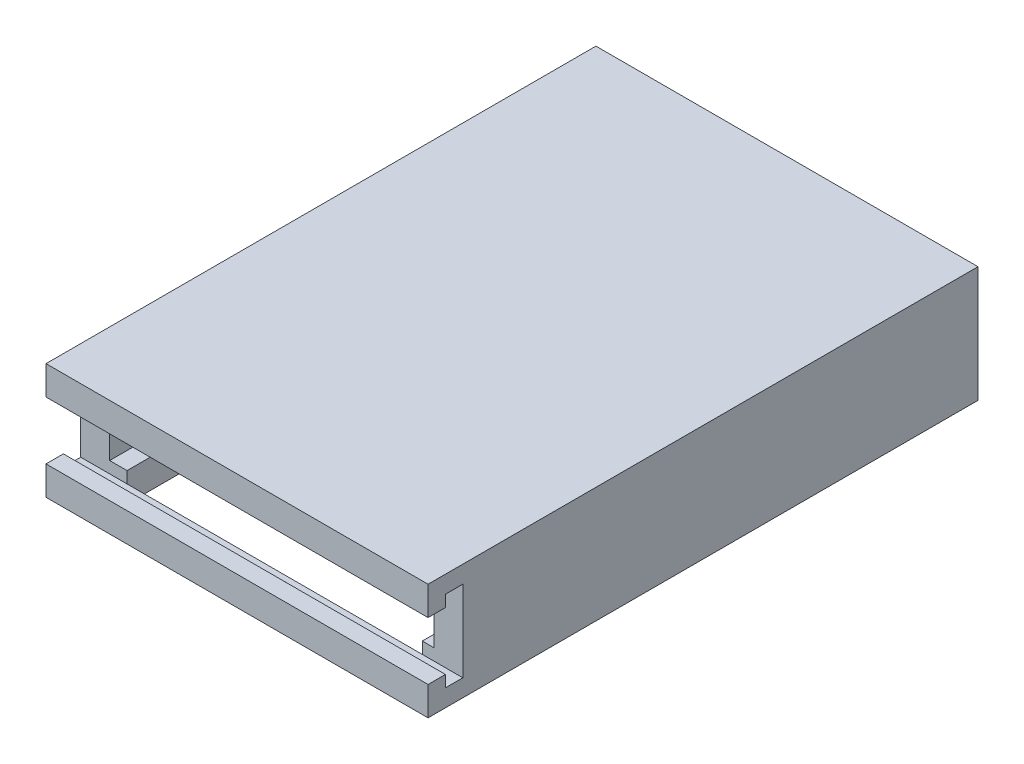
ISO-10303-21;
HEADER;
FILE_DESCRIPTION(('STEP AP214'),'2;1');
FILE_NAME('part.step','',(''),(''),'','','');
FILE_SCHEMA(('AUTOMOTIVE_DESIGN { 1 0 10303 214 1 1 1 1 }'));
ENDSEC;
DATA;
#1=APPLICATION_CONTEXT('core data for automotive mechanical design processes');
#2=APPLICATION_PROTOCOL_DEFINITION('international standard','automotive_design',2000,#1);
#3=PRODUCT_CONTEXT('',#1,'mechanical');
#4=PRODUCT('Part','Part','',(#3));
#5=PRODUCT_RELATED_PRODUCT_CATEGORY('part','',(#4));
#6=PRODUCT_DEFINITION_FORMATION('','',#4);
#7=PRODUCT_DEFINITION_CONTEXT('part definition',#1,'design');
#8=PRODUCT_DEFINITION('design','',#6,#7);
#9=PRODUCT_DEFINITION_SHAPE('','',#8);
#10=(LENGTH_UNIT() NAMED_UNIT(*) SI_UNIT(.MILLI.,.METRE.));
#11=(NAMED_UNIT(*) PLANE_ANGLE_UNIT() SI_UNIT($,.RADIAN.));
#12=(NAMED_UNIT(*) SI_UNIT($,.STERADIAN.) SOLID_ANGLE_UNIT());
#13=UNCERTAINTY_MEASURE_WITH_UNIT(LENGTH_MEASURE(1.E-05),#10,'distance_accuracy_value','');
#14=(GEOMETRIC_REPRESENTATION_CONTEXT(3) GLOBAL_UNCERTAINTY_ASSIGNED_CONTEXT((#13)) GLOBAL_UNIT_ASSIGNED_CONTEXT((#10,
#11,#12)) REPRESENTATION_CONTEXT('',''));
#15=CARTESIAN_POINT('',(0.,0.,0.));
#16=DIRECTION('',(0.,0.,1.));
#17=DIRECTION('',(1.,0.,0.));
#18=AXIS2_PLACEMENT_3D('',#15,#16,#17);
#19=CARTESIAN_POINT('',(0.,0.,84.));
#20=DIRECTION('',(0.,0.,1.));
#21=DIRECTION('',(1.,0.,0.));
#22=AXIS2_PLACEMENT_3D('',#19,#20,#21);
#23=PLANE('',#22);
#24=DIRECTION('',(-1.,0.,0.));
#25=VECTOR('',#24,1.);
#26=CARTESIAN_POINT('',(61.,-2.,84.));
#27=LINE('',#26,#25);
#28=CARTESIAN_POINT('',(61.,-2.,84.));
#29=VERTEX_POINT('',#28);
#30=CARTESIAN_POINT('',(54.,-2.,84.));
#31=VERTEX_POINT('',#30);
#32=EDGE_CURVE('E54',#29,#31,#27,.T.);
#33=ORIENTED_EDGE('',*,*,#32,.F.);
#34=DIRECTION('',(0.,1.,0.));
#35=VECTOR('',#34,1.);
#36=CARTESIAN_POINT('',(61.,0.,84.));
#37=LINE('',#36,#35);
#38=CARTESIAN_POINT('',(61.,12.,84.));
#39=VERTEX_POINT('',#38);
#40=EDGE_CURVE('E196',#29,#39,#37,.T.);
#41=ORIENTED_EDGE('',*,*,#40,.T.);
#42=DIRECTION('',(-1.,0.,0.));
#43=VECTOR('',#42,1.);
#44=CARTESIAN_POINT('',(61.,12.,84.));
#45=LINE('',#44,#43);
#46=CARTESIAN_POINT('',(-5.,12.,84.));
#47=VERTEX_POINT('',#46);
#48=EDGE_CURVE('E357',#39,#47,#45,.T.);
#49=ORIENTED_EDGE('',*,*,#48,.T.);
#50=DIRECTION('',(0.,1.,0.));
#51=VECTOR('',#50,1.);
#52=CARTESIAN_POINT('',(-5.,0.,84.));
#53=LINE('',#52,#51);
#54=CARTESIAN_POINT('',(-5.,-2.,84.));
#55=VERTEX_POINT('',#54);
#56=EDGE_CURVE('E62',#55,#47,#53,.T.);
#57=ORIENTED_EDGE('',*,*,#56,.F.);
#58=CARTESIAN_POINT('',(3.,-2.,84.));
#59=VERTEX_POINT('',#58);
#60=EDGE_CURVE('E204',#59,#55,#27,.T.);
#61=ORIENTED_EDGE('',*,*,#60,.F.);
#62=DIRECTION('',(0.,1.,0.));
#63=VECTOR('',#62,1.);
#64=CARTESIAN_POINT('',(3.,-5.,84.));
#65=LINE('',#64,#63);
#66=CARTESIAN_POINT('',(3.,0.,84.));
#67=VERTEX_POINT('',#66);
#68=EDGE_CURVE('E295',#59,#67,#65,.T.);
#69=ORIENTED_EDGE('',*,*,#68,.T.);
#70=DIRECTION('',(-1.,0.,0.));
#71=VECTOR('',#70,1.);
#72=CARTESIAN_POINT('',(-5.,0.,84.));
#73=LINE('',#72,#71);
#74=CARTESIAN_POINT('',(0.,0.,84.));
#75=VERTEX_POINT('',#74);
#76=EDGE_CURVE('E292',#67,#75,#73,.T.);
#77=ORIENTED_EDGE('',*,*,#76,.T.);
#78=DIRECTION('',(0.,1.,0.));
#79=VECTOR('',#78,1.);
#80=CARTESIAN_POINT('',(0.,0.,84.));
#81=LINE('',#80,#79);
#82=CARTESIAN_POINT('',(0.,10.,84.));
#83=VERTEX_POINT('',#82);
#84=EDGE_CURVE('E211',#75,#83,#81,.T.);
#85=ORIENTED_EDGE('',*,*,#84,.T.);
#86=DIRECTION('',(1.,0.,0.));
#87=VECTOR('',#86,1.);
#88=CARTESIAN_POINT('',(0.,10.,84.));
#89=LINE('',#88,#87);
#90=CARTESIAN_POINT('',(56.,10.,84.));
#91=VERTEX_POINT('',#90);
#92=EDGE_CURVE('E220',#83,#91,#89,.T.);
#93=ORIENTED_EDGE('',*,*,#92,.T.);
#94=DIRECTION('',(0.,1.,0.));
#95=VECTOR('',#94,1.);
#96=CARTESIAN_POINT('',(56.,0.,84.));
#97=LINE('',#96,#95);
#98=CARTESIAN_POINT('',(56.,0.,84.));
#99=VERTEX_POINT('',#98);
#100=EDGE_CURVE('E222',#99,#91,#97,.T.);
#101=ORIENTED_EDGE('',*,*,#100,.F.);
#102=DIRECTION('',(-1.,0.,0.));
#103=VECTOR('',#102,1.);
#104=CARTESIAN_POINT('',(61.,0.,84.));
#105=LINE('',#104,#103);
#106=CARTESIAN_POINT('',(54.,0.,84.));
#107=VERTEX_POINT('',#106);
#108=EDGE_CURVE('E264',#99,#107,#105,.T.);
#109=ORIENTED_EDGE('',*,*,#108,.T.);
#110=DIRECTION('',(0.,1.,0.));
#111=VECTOR('',#110,1.);
#112=CARTESIAN_POINT('',(54.,-5.,84.));
#113=LINE('',#112,#111);
#114=EDGE_CURVE('E199',#31,#107,#113,.T.);
#115=ORIENTED_EDGE('',*,*,#114,.F.);
#116=EDGE_LOOP('',(#33,#41,#49,#57,#61,#69,#77,#85,#93,#101,#109,#115));
#117=FACE_BOUND('',#116,.T.);
#118=ADVANCED_FACE('F39',(#117),#23,.T.);
#119=CARTESIAN_POINT('',(61.,0.,84.));
#120=DIRECTION('',(-1.,0.,0.));
#121=DIRECTION('',(0.,0.,1.));
#122=AXIS2_PLACEMENT_3D('',#119,#120,#121);
#123=PLANE('',#122);
#124=DIRECTION('',(0.,0.,1.));
#125=VECTOR('',#124,1.);
#126=CARTESIAN_POINT('',(61.,-5.,0.));
#127=LINE('',#126,#125);
#128=CARTESIAN_POINT('',(61.,-5.,-5.));
#129=VERTEX_POINT('',#128);
#130=CARTESIAN_POINT('',(61.,-5.,90.));
#131=VERTEX_POINT('',#130);
#132=EDGE_CURVE('E275',#129,#131,#127,.T.);
#133=ORIENTED_EDGE('',*,*,#132,.F.);
#134=DIRECTION('',(0.,-1.,0.));
#135=VECTOR('',#134,1.);
#136=CARTESIAN_POINT('',(61.,15.,-5.));
#137=LINE('',#136,#135);
#138=CARTESIAN_POINT('',(61.,15.,-5.));
#139=VERTEX_POINT('',#138);
#140=EDGE_CURVE('E273',#139,#129,#137,.T.);
#141=ORIENTED_EDGE('',*,*,#140,.F.);
#142=DIRECTION('',(0.,0.,-1.));
#143=VECTOR('',#142,1.);
#144=CARTESIAN_POINT('',(61.,15.,84.));
#145=LINE('',#144,#143);
#146=CARTESIAN_POINT('',(61.,15.,90.));
#147=VERTEX_POINT('',#146);
#148=EDGE_CURVE('E11',#147,#139,#145,.T.);
#149=ORIENTED_EDGE('',*,*,#148,.F.);
#150=DIRECTION('',(0.,1.,0.));
#151=VECTOR('',#150,1.);
#152=CARTESIAN_POINT('',(61.,15.,90.));
#153=LINE('',#152,#151);
#154=CARTESIAN_POINT('',(61.,10.,90.));
#155=VERTEX_POINT('',#154);
#156=EDGE_CURVE('E354',#155,#147,#153,.T.);
#157=ORIENTED_EDGE('',*,*,#156,.F.);
#158=DIRECTION('',(0.,0.,1.));
#159=VECTOR('',#158,1.);
#160=CARTESIAN_POINT('',(61.,10.,90.));
#161=LINE('',#160,#159);
#162=CARTESIAN_POINT('',(61.,10.,87.));
#163=VERTEX_POINT('',#162);
#164=EDGE_CURVE('E351',#163,#155,#161,.T.);
#165=ORIENTED_EDGE('',*,*,#164,.F.);
#166=DIRECTION('',(0.,-1.,0.));
#167=VECTOR('',#166,1.);
#168=CARTESIAN_POINT('',(61.,10.,87.));
#169=LINE('',#168,#167);
#170=CARTESIAN_POINT('',(61.,12.,87.));
#171=VERTEX_POINT('',#170);
#172=EDGE_CURVE('E348',#171,#163,#169,.T.);
#173=ORIENTED_EDGE('',*,*,#172,.F.);
#174=DIRECTION('',(0.,0.,1.));
#175=VECTOR('',#174,1.);
#176=CARTESIAN_POINT('',(61.,12.,87.));
#177=LINE('',#176,#175);
#178=EDGE_CURVE('E208',#39,#171,#177,.T.);
#179=ORIENTED_EDGE('',*,*,#178,.F.);
#180=ORIENTED_EDGE('',*,*,#40,.F.);
#181=DIRECTION('',(0.,0.,-1.));
#182=VECTOR('',#181,1.);
#183=CARTESIAN_POINT('',(61.,-2.,87.));
#184=LINE('',#183,#182);
#185=CARTESIAN_POINT('',(61.,-2.,87.));
#186=VERTEX_POINT('',#185);
#187=EDGE_CURVE('E182',#186,#29,#184,.T.);
#188=ORIENTED_EDGE('',*,*,#187,.F.);
#189=DIRECTION('',(0.,-1.,0.));
#190=VECTOR('',#189,1.);
#191=CARTESIAN_POINT('',(61.,0.,87.));
#192=LINE('',#191,#190);
#193=CARTESIAN_POINT('',(61.,0.,87.));
#194=VERTEX_POINT('',#193);
#195=EDGE_CURVE('E405',#194,#186,#192,.T.);
#196=ORIENTED_EDGE('',*,*,#195,.F.);
#197=DIRECTION('',(0.,0.,-1.));
#198=VECTOR('',#197,1.);
#199=CARTESIAN_POINT('',(61.,0.,90.));
#200=LINE('',#199,#198);
#201=CARTESIAN_POINT('',(61.,0.,90.));
#202=VERTEX_POINT('',#201);
#203=EDGE_CURVE('E402',#202,#194,#200,.T.);
#204=ORIENTED_EDGE('',*,*,#203,.F.);
#205=DIRECTION('',(0.,1.,0.));
#206=VECTOR('',#205,1.);
#207=CARTESIAN_POINT('',(61.,-5.,90.));
#208=LINE('',#207,#206);
#209=EDGE_CURVE('E190',#131,#202,#208,.T.);
#210=ORIENTED_EDGE('',*,*,#209,.F.);
#211=EDGE_LOOP('',(#133,#141,#149,#157,#165,#173,#179,#180,#188,#196,#204,#210));
#212=FACE_BOUND('',#211,.T.);
#213=ADVANCED_FACE('F41',(#212),#123,.F.);
#214=CARTESIAN_POINT('',(0.,15.,84.));
#215=DIRECTION('',(0.,1.,0.));
#216=DIRECTION('',(0.,0.,1.));
#217=AXIS2_PLACEMENT_3D('',#214,#215,#216);
#218=PLANE('',#217);
#219=ORIENTED_EDGE('',*,*,#148,.T.);
#220=DIRECTION('',(1.,0.,0.));
#221=VECTOR('',#220,1.);
#222=CARTESIAN_POINT('',(61.,15.,-5.));
#223=LINE('',#222,#221);
#224=CARTESIAN_POINT('',(-5.,15.,-5.));
#225=VERTEX_POINT('',#224);
#226=EDGE_CURVE('E258',#225,#139,#223,.T.);
#227=ORIENTED_EDGE('',*,*,#226,.F.);
#228=DIRECTION('',(0.,0.,-1.));
#229=VECTOR('',#228,1.);
#230=CARTESIAN_POINT('',(-5.,15.,84.));
#231=LINE('',#230,#229);
#232=CARTESIAN_POINT('',(-5.,15.,90.));
#233=VERTEX_POINT('',#232);
#234=EDGE_CURVE('E47',#233,#225,#231,.T.);
#235=ORIENTED_EDGE('',*,*,#234,.F.);
#236=DIRECTION('',(-1.,0.,0.));
#237=VECTOR('',#236,1.);
#238=CARTESIAN_POINT('',(61.,15.,90.));
#239=LINE('',#238,#237);
#240=EDGE_CURVE('E274',#147,#233,#239,.T.);
#241=ORIENTED_EDGE('',*,*,#240,.F.);
#242=EDGE_LOOP('',(#219,#227,#235,#241));
#243=FACE_BOUND('',#242,.T.);
#244=ADVANCED_FACE('F263',(#243),#218,.T.);
#245=CARTESIAN_POINT('',(-5.,0.,84.));
#246=DIRECTION('',(-1.,0.,0.));
#247=DIRECTION('',(0.,0.,1.));
#248=AXIS2_PLACEMENT_3D('',#245,#246,#247);
#249=PLANE('',#248);
#250=ORIENTED_EDGE('',*,*,#234,.T.);
#251=DIRECTION('',(0.,1.,0.));
#252=VECTOR('',#251,1.);
#253=CARTESIAN_POINT('',(-5.,15.,-5.));
#254=LINE('',#253,#252);
#255=CARTESIAN_POINT('',(-5.,-5.,-5.));
#256=VERTEX_POINT('',#255);
#257=EDGE_CURVE('E245',#256,#225,#254,.T.);
#258=ORIENTED_EDGE('',*,*,#257,.F.);
#259=DIRECTION('',(0.,0.,-1.));
#260=VECTOR('',#259,1.);
#261=CARTESIAN_POINT('',(-5.,-5.,84.));
#262=LINE('',#261,#260);
#263=CARTESIAN_POINT('',(-5.,-5.,90.));
#264=VERTEX_POINT('',#263);
#265=EDGE_CURVE('E289',#264,#256,#262,.T.);
#266=ORIENTED_EDGE('',*,*,#265,.F.);
#267=DIRECTION('',(0.,1.,0.));
#268=VECTOR('',#267,1.);
#269=CARTESIAN_POINT('',(-5.,-5.,90.));
#270=LINE('',#269,#268);
#271=CARTESIAN_POINT('',(-5.,0.,90.));
#272=VERTEX_POINT('',#271);
#273=EDGE_CURVE('E383',#264,#272,#270,.T.);
#274=ORIENTED_EDGE('',*,*,#273,.T.);
#275=DIRECTION('',(0.,0.,-1.));
#276=VECTOR('',#275,1.);
#277=CARTESIAN_POINT('',(-5.,0.,90.));
#278=LINE('',#277,#276);
#279=CARTESIAN_POINT('',(-5.,0.,87.));
#280=VERTEX_POINT('',#279);
#281=EDGE_CURVE('E386',#272,#280,#278,.T.);
#282=ORIENTED_EDGE('',*,*,#281,.T.);
#283=DIRECTION('',(0.,-1.,0.));
#284=VECTOR('',#283,1.);
#285=CARTESIAN_POINT('',(-5.,0.,87.));
#286=LINE('',#285,#284);
#287=CARTESIAN_POINT('',(-5.,-2.,87.));
#288=VERTEX_POINT('',#287);
#289=EDGE_CURVE('E191',#280,#288,#286,.T.);
#290=ORIENTED_EDGE('',*,*,#289,.T.);
#291=DIRECTION('',(0.,0.,-1.));
#292=VECTOR('',#291,1.);
#293=CARTESIAN_POINT('',(-5.,-2.,87.));
#294=LINE('',#293,#292);
#295=EDGE_CURVE('E389',#288,#55,#294,.T.);
#296=ORIENTED_EDGE('',*,*,#295,.T.);
#297=ORIENTED_EDGE('',*,*,#56,.T.);
#298=DIRECTION('',(0.,0.,1.));
#299=VECTOR('',#298,1.);
#300=CARTESIAN_POINT('',(-5.,12.,87.));
#301=LINE('',#300,#299);
#302=CARTESIAN_POINT('',(-5.,12.,87.));
#303=VERTEX_POINT('',#302);
#304=EDGE_CURVE('E358',#47,#303,#301,.T.);
#305=ORIENTED_EDGE('',*,*,#304,.T.);
#306=DIRECTION('',(0.,-1.,0.));
#307=VECTOR('',#306,1.);
#308=CARTESIAN_POINT('',(-5.,10.,87.));
#309=LINE('',#308,#307);
#310=CARTESIAN_POINT('',(-5.,10.,87.));
#311=VERTEX_POINT('',#310);
#312=EDGE_CURVE('E360',#303,#311,#309,.T.);
#313=ORIENTED_EDGE('',*,*,#312,.T.);
#314=DIRECTION('',(0.,0.,1.));
#315=VECTOR('',#314,1.);
#316=CARTESIAN_POINT('',(-5.,10.,90.));
#317=LINE('',#316,#315);
#318=CARTESIAN_POINT('',(-5.,10.,90.));
#319=VERTEX_POINT('',#318);
#320=EDGE_CURVE('E363',#311,#319,#317,.T.);
#321=ORIENTED_EDGE('',*,*,#320,.T.);
#322=DIRECTION('',(0.,1.,0.));
#323=VECTOR('',#322,1.);
#324=CARTESIAN_POINT('',(-5.,15.,90.));
#325=LINE('',#324,#323);
#326=EDGE_CURVE('E248',#319,#233,#325,.T.);
#327=ORIENTED_EDGE('',*,*,#326,.T.);
#328=EDGE_LOOP('',(#250,#258,#266,#274,#282,#290,#296,#297,#305,#313,#321,#327));
#329=FACE_BOUND('',#328,.T.);
#330=ADVANCED_FACE('F244',(#329),#249,.T.);
#331=CARTESIAN_POINT('',(0.,0.,84.));
#332=DIRECTION('',(-1.,0.,0.));
#333=DIRECTION('',(0.,0.,1.));
#334=AXIS2_PLACEMENT_3D('',#331,#332,#333);
#335=PLANE('',#334);
#336=DIRECTION('',(0.,1.,0.));
#337=VECTOR('',#336,1.);
#338=CARTESIAN_POINT('',(0.,0.,0.));
#339=LINE('',#338,#337);
#340=CARTESIAN_POINT('',(0.,0.,0.));
#341=VERTEX_POINT('',#340);
#342=CARTESIAN_POINT('',(0.,10.,0.));
#343=VERTEX_POINT('',#342);
#344=EDGE_CURVE('E226',#341,#343,#339,.T.);
#345=ORIENTED_EDGE('',*,*,#344,.T.);
#346=DIRECTION('',(0.,0.,-1.));
#347=VECTOR('',#346,1.);
#348=CARTESIAN_POINT('',(0.,10.,84.));
#349=LINE('',#348,#347);
#350=EDGE_CURVE('E236',#83,#343,#349,.T.);
#351=ORIENTED_EDGE('',*,*,#350,.F.);
#352=ORIENTED_EDGE('',*,*,#84,.F.);
#353=DIRECTION('',(0.,0.,-1.));
#354=VECTOR('',#353,1.);
#355=CARTESIAN_POINT('',(0.,0.,84.));
#356=LINE('',#355,#354);
#357=EDGE_CURVE('E239',#75,#341,#356,.T.);
#358=ORIENTED_EDGE('',*,*,#357,.T.);
#359=EDGE_LOOP('',(#345,#351,#352,#358));
#360=FACE_BOUND('',#359,.T.);
#361=ADVANCED_FACE('F317',(#360),#335,.F.);
#362=CARTESIAN_POINT('',(0.,10.,84.));
#363=DIRECTION('',(0.,1.,0.));
#364=DIRECTION('',(-1.,0.,0.));
#365=AXIS2_PLACEMENT_3D('',#362,#363,#364);
#366=PLANE('',#365);
#367=DIRECTION('',(1.,0.,0.));
#368=VECTOR('',#367,1.);
#369=CARTESIAN_POINT('',(0.,10.,0.));
#370=LINE('',#369,#368);
#371=CARTESIAN_POINT('',(56.,10.,0.));
#372=VERTEX_POINT('',#371);
#373=EDGE_CURVE('E213',#343,#372,#370,.T.);
#374=ORIENTED_EDGE('',*,*,#373,.T.);
#375=DIRECTION('',(0.,0.,-1.));
#376=VECTOR('',#375,1.);
#377=CARTESIAN_POINT('',(56.,10.,84.));
#378=LINE('',#377,#376);
#379=EDGE_CURVE('E233',#91,#372,#378,.T.);
#380=ORIENTED_EDGE('',*,*,#379,.F.);
#381=ORIENTED_EDGE('',*,*,#92,.F.);
#382=ORIENTED_EDGE('',*,*,#350,.T.);
#383=EDGE_LOOP('',(#374,#380,#381,#382));
#384=FACE_BOUND('',#383,.T.);
#385=ADVANCED_FACE('F324',(#384),#366,.F.);
#386=CARTESIAN_POINT('',(56.,0.,84.));
#387=DIRECTION('',(-1.,0.,0.));
#388=DIRECTION('',(0.,0.,1.));
#389=AXIS2_PLACEMENT_3D('',#386,#387,#388);
#390=PLANE('',#389);
#391=DIRECTION('',(0.,1.,0.));
#392=VECTOR('',#391,1.);
#393=CARTESIAN_POINT('',(56.,0.,0.));
#394=LINE('',#393,#392);
#395=CARTESIAN_POINT('',(56.,0.,0.));
#396=VERTEX_POINT('',#395);
#397=EDGE_CURVE('E209',#396,#372,#394,.T.);
#398=ORIENTED_EDGE('',*,*,#397,.F.);
#399=DIRECTION('',(0.,0.,-1.));
#400=VECTOR('',#399,1.);
#401=CARTESIAN_POINT('',(56.,0.,84.));
#402=LINE('',#401,#400);
#403=EDGE_CURVE('E225',#99,#396,#402,.T.);
#404=ORIENTED_EDGE('',*,*,#403,.F.);
#405=ORIENTED_EDGE('',*,*,#100,.T.);
#406=ORIENTED_EDGE('',*,*,#379,.T.);
#407=EDGE_LOOP('',(#398,#404,#405,#406));
#408=FACE_BOUND('',#407,.T.);
#409=ADVANCED_FACE('F327',(#408),#390,.T.);
#410=CARTESIAN_POINT('',(0.,0.,0.));
#411=DIRECTION('',(0.,-1.,0.));
#412=DIRECTION('',(0.,0.,-1.));
#413=AXIS2_PLACEMENT_3D('',#410,#411,#412);
#414=PLANE('',#413);
#415=DIRECTION('',(1.,0.,0.));
#416=VECTOR('',#415,1.);
#417=CARTESIAN_POINT('',(-5.,0.,0.));
#418=LINE('',#417,#416);
#419=CARTESIAN_POINT('',(3.00000000000001,0.,0.));
#420=VERTEX_POINT('',#419);
#421=EDGE_CURVE('E288',#341,#420,#418,.T.);
#422=ORIENTED_EDGE('',*,*,#421,.F.);
#423=ORIENTED_EDGE('',*,*,#357,.F.);
#424=ORIENTED_EDGE('',*,*,#76,.F.);
#425=DIRECTION('',(0.,0.,1.));
#426=VECTOR('',#425,1.);
#427=CARTESIAN_POINT('',(3.,0.,84.));
#428=LINE('',#427,#426);
#429=EDGE_CURVE('E297',#420,#67,#428,.T.);
#430=ORIENTED_EDGE('',*,*,#429,.F.);
#431=EDGE_LOOP('',(#422,#423,#424,#430));
#432=FACE_BOUND('',#431,.T.);
#433=ADVANCED_FACE('F315',(#432),#414,.F.);
#434=CARTESIAN_POINT('',(3.,-5.,84.));
#435=DIRECTION('',(-1.,0.,0.));
#436=DIRECTION('',(0.,0.,1.));
#437=AXIS2_PLACEMENT_3D('',#434,#435,#436);
#438=PLANE('',#437);
#439=ORIENTED_EDGE('',*,*,#429,.T.);
#440=ORIENTED_EDGE('',*,*,#68,.F.);
#441=CARTESIAN_POINT('',(3.,-5.,84.));
#442=VERTEX_POINT('',#441);
#443=EDGE_CURVE('E301',#442,#59,#65,.T.);
#444=ORIENTED_EDGE('',*,*,#443,.F.);
#445=DIRECTION('',(0.,0.,1.));
#446=VECTOR('',#445,1.);
#447=CARTESIAN_POINT('',(3.,-5.,84.));
#448=LINE('',#447,#446);
#449=CARTESIAN_POINT('',(3.,-5.,0.));
#450=VERTEX_POINT('',#449);
#451=EDGE_CURVE('E291',#450,#442,#448,.T.);
#452=ORIENTED_EDGE('',*,*,#451,.F.);
#453=DIRECTION('',(0.,1.,0.));
#454=VECTOR('',#453,1.);
#455=CARTESIAN_POINT('',(3.00000000000001,-5.,0.));
#456=LINE('',#455,#454);
#457=EDGE_CURVE('E216',#450,#420,#456,.T.);
#458=ORIENTED_EDGE('',*,*,#457,.T.);
#459=EDGE_LOOP('',(#439,#440,#444,#452,#458));
#460=FACE_BOUND('',#459,.T.);
#461=ADVANCED_FACE('F310',(#460),#438,.F.);
#462=CARTESIAN_POINT('',(0.,-5.,0.));
#463=DIRECTION('',(0.,-1.,0.));
#464=DIRECTION('',(0.,0.,-1.));
#465=AXIS2_PLACEMENT_3D('',#462,#463,#464);
#466=PLANE('',#465);
#467=DIRECTION('',(-1.,0.,0.));
#468=VECTOR('',#467,1.);
#469=CARTESIAN_POINT('',(61.,-5.,90.));
#470=LINE('',#469,#468);
#471=EDGE_CURVE('E340',#131,#264,#470,.T.);
#472=ORIENTED_EDGE('',*,*,#471,.T.);
#473=ORIENTED_EDGE('',*,*,#265,.T.);
#474=DIRECTION('',(-1.,0.,0.));
#475=VECTOR('',#474,1.);
#476=CARTESIAN_POINT('',(61.,-5.,-5.));
#477=LINE('',#476,#475);
#478=EDGE_CURVE('E261',#129,#256,#477,.T.);
#479=ORIENTED_EDGE('',*,*,#478,.F.);
#480=ORIENTED_EDGE('',*,*,#132,.T.);
#481=EDGE_LOOP('',(#472,#473,#479,#480));
#482=FACE_BOUND('',#481,.T.);
#483=ORIENTED_EDGE('',*,*,#451,.T.);
#484=DIRECTION('',(-1.,0.,0.));
#485=VECTOR('',#484,1.);
#486=CARTESIAN_POINT('',(61.,-5.,84.));
#487=LINE('',#486,#485);
#488=CARTESIAN_POINT('',(54.,-5.,84.));
#489=VERTEX_POINT('',#488);
#490=EDGE_CURVE('E201',#489,#442,#487,.T.);
#491=ORIENTED_EDGE('',*,*,#490,.F.);
#492=DIRECTION('',(0.,0.,-1.));
#493=VECTOR('',#492,1.);
#494=CARTESIAN_POINT('',(54.,-5.,0.));
#495=LINE('',#494,#493);
#496=CARTESIAN_POINT('',(54.,-5.,0.));
#497=VERTEX_POINT('',#496);
#498=EDGE_CURVE('E277',#489,#497,#495,.T.);
#499=ORIENTED_EDGE('',*,*,#498,.T.);
#500=DIRECTION('',(-1.,0.,0.));
#501=VECTOR('',#500,1.);
#502=CARTESIAN_POINT('',(61.,-5.,0.));
#503=LINE('',#502,#501);
#504=EDGE_CURVE('E270',#497,#450,#503,.T.);
#505=ORIENTED_EDGE('',*,*,#504,.T.);
#506=EDGE_LOOP('',(#483,#491,#499,#505));
#507=FACE_BOUND('',#506,.T.);
#508=ADVANCED_FACE('F339',(#482,#507),#466,.T.);
#509=CARTESIAN_POINT('',(54.,-5.,0.));
#510=DIRECTION('',(1.,0.,0.));
#511=DIRECTION('',(0.,0.,-1.));
#512=AXIS2_PLACEMENT_3D('',#509,#510,#511);
#513=PLANE('',#512);
#514=DIRECTION('',(0.,0.,-1.));
#515=VECTOR('',#514,1.);
#516=CARTESIAN_POINT('',(54.,0.,0.));
#517=LINE('',#516,#515);
#518=CARTESIAN_POINT('',(54.,0.,0.));
#519=VERTEX_POINT('',#518);
#520=EDGE_CURVE('E266',#107,#519,#517,.T.);
#521=ORIENTED_EDGE('',*,*,#520,.T.);
#522=DIRECTION('',(0.,1.,0.));
#523=VECTOR('',#522,1.);
#524=CARTESIAN_POINT('',(54.,-5.,0.));
#525=LINE('',#524,#523);
#526=EDGE_CURVE('E280',#497,#519,#525,.T.);
#527=ORIENTED_EDGE('',*,*,#526,.F.);
#528=ORIENTED_EDGE('',*,*,#498,.F.);
#529=EDGE_CURVE('E286',#489,#31,#113,.T.);
#530=ORIENTED_EDGE('',*,*,#529,.T.);
#531=ORIENTED_EDGE('',*,*,#114,.T.);
#532=EDGE_LOOP('',(#521,#527,#528,#530,#531));
#533=FACE_BOUND('',#532,.T.);
#534=ADVANCED_FACE('F334',(#533),#513,.F.);
#535=CARTESIAN_POINT('',(0.,0.,0.));
#536=DIRECTION('',(0.,-1.,0.));
#537=DIRECTION('',(0.,0.,-1.));
#538=AXIS2_PLACEMENT_3D('',#535,#536,#537);
#539=PLANE('',#538);
#540=ORIENTED_EDGE('',*,*,#403,.T.);
#541=DIRECTION('',(1.,0.,0.));
#542=VECTOR('',#541,1.);
#543=CARTESIAN_POINT('',(61.,0.,0.));
#544=LINE('',#543,#542);
#545=EDGE_CURVE('E278',#519,#396,#544,.T.);
#546=ORIENTED_EDGE('',*,*,#545,.F.);
#547=ORIENTED_EDGE('',*,*,#520,.F.);
#548=ORIENTED_EDGE('',*,*,#108,.F.);
#549=EDGE_LOOP('',(#540,#546,#547,#548));
#550=FACE_BOUND('',#549,.T.);
#551=ADVANCED_FACE('F330',(#550),#539,.F.);
#552=CARTESIAN_POINT('',(0.,0.,0.));
#553=DIRECTION('',(0.,0.,-1.));
#554=DIRECTION('',(-1.,0.,0.));
#555=AXIS2_PLACEMENT_3D('',#552,#553,#554);
#556=PLANE('',#555);
#557=ORIENTED_EDGE('',*,*,#504,.F.);
#558=ORIENTED_EDGE('',*,*,#526,.T.);
#559=ORIENTED_EDGE('',*,*,#545,.T.);
#560=ORIENTED_EDGE('',*,*,#397,.T.);
#561=ORIENTED_EDGE('',*,*,#373,.F.);
#562=ORIENTED_EDGE('',*,*,#344,.F.);
#563=ORIENTED_EDGE('',*,*,#421,.T.);
#564=ORIENTED_EDGE('',*,*,#457,.F.);
#565=EDGE_LOOP('',(#557,#558,#559,#560,#561,#562,#563,#564));
#566=FACE_BOUND('',#565,.T.);
#567=ADVANCED_FACE('F424',(#566),#556,.F.);
#568=CARTESIAN_POINT('',(0.,0.,-5.));
#569=DIRECTION('',(0.,0.,-1.));
#570=DIRECTION('',(-1.,0.,0.));
#571=AXIS2_PLACEMENT_3D('',#568,#569,#570);
#572=PLANE('',#571);
#573=ORIENTED_EDGE('',*,*,#140,.T.);
#574=ORIENTED_EDGE('',*,*,#478,.T.);
#575=ORIENTED_EDGE('',*,*,#257,.T.);
#576=ORIENTED_EDGE('',*,*,#226,.T.);
#577=EDGE_LOOP('',(#573,#574,#575,#576));
#578=FACE_BOUND('',#577,.T.);
#579=ADVANCED_FACE('F257',(#578),#572,.T.);
#580=CARTESIAN_POINT('',(61.,15.,90.));
#581=DIRECTION('',(0.,0.,1.));
#582=DIRECTION('',(1.,0.,0.));
#583=AXIS2_PLACEMENT_3D('',#580,#581,#582);
#584=PLANE('',#583);
#585=ORIENTED_EDGE('',*,*,#326,.F.);
#586=DIRECTION('',(-1.,0.,0.));
#587=VECTOR('',#586,1.);
#588=CARTESIAN_POINT('',(61.,10.,90.));
#589=LINE('',#588,#587);
#590=EDGE_CURVE('E367',#155,#319,#589,.T.);
#591=ORIENTED_EDGE('',*,*,#590,.F.);
#592=ORIENTED_EDGE('',*,*,#156,.T.);
#593=ORIENTED_EDGE('',*,*,#240,.T.);
#594=EDGE_LOOP('',(#585,#591,#592,#593));
#595=FACE_BOUND('',#594,.T.);
#596=ADVANCED_FACE('F416',(#595),#584,.T.);
#597=CARTESIAN_POINT('',(61.,10.,90.));
#598=DIRECTION('',(0.,-1.,0.));
#599=DIRECTION('',(0.,0.,-1.));
#600=AXIS2_PLACEMENT_3D('',#597,#598,#599);
#601=PLANE('',#600);
#602=ORIENTED_EDGE('',*,*,#320,.F.);
#603=DIRECTION('',(-1.,0.,0.));
#604=VECTOR('',#603,1.);
#605=CARTESIAN_POINT('',(61.,10.,87.));
#606=LINE('',#605,#604);
#607=EDGE_CURVE('E369',#163,#311,#606,.T.);
#608=ORIENTED_EDGE('',*,*,#607,.F.);
#609=ORIENTED_EDGE('',*,*,#164,.T.);
#610=ORIENTED_EDGE('',*,*,#590,.T.);
#611=EDGE_LOOP('',(#602,#608,#609,#610));
#612=FACE_BOUND('',#611,.T.);
#613=ADVANCED_FACE('F414',(#612),#601,.T.);
#614=CARTESIAN_POINT('',(61.,10.,87.));
#615=DIRECTION('',(0.,0.,-1.));
#616=DIRECTION('',(-1.,0.,0.));
#617=AXIS2_PLACEMENT_3D('',#614,#615,#616);
#618=PLANE('',#617);
#619=ORIENTED_EDGE('',*,*,#312,.F.);
#620=DIRECTION('',(-1.,0.,0.));
#621=VECTOR('',#620,1.);
#622=CARTESIAN_POINT('',(61.,12.,87.));
#623=LINE('',#622,#621);
#624=EDGE_CURVE('E371',#171,#303,#623,.T.);
#625=ORIENTED_EDGE('',*,*,#624,.F.);
#626=ORIENTED_EDGE('',*,*,#172,.T.);
#627=ORIENTED_EDGE('',*,*,#607,.T.);
#628=EDGE_LOOP('',(#619,#625,#626,#627));
#629=FACE_BOUND('',#628,.T.);
#630=ADVANCED_FACE('F411',(#629),#618,.T.);
#631=CARTESIAN_POINT('',(61.,12.,87.));
#632=DIRECTION('',(0.,-1.,0.));
#633=DIRECTION('',(0.,0.,-1.));
#634=AXIS2_PLACEMENT_3D('',#631,#632,#633);
#635=PLANE('',#634);
#636=ORIENTED_EDGE('',*,*,#304,.F.);
#637=ORIENTED_EDGE('',*,*,#48,.F.);
#638=ORIENTED_EDGE('',*,*,#178,.T.);
#639=ORIENTED_EDGE('',*,*,#624,.T.);
#640=EDGE_LOOP('',(#636,#637,#638,#639));
#641=FACE_BOUND('',#640,.T.);
#642=ADVANCED_FACE('F407',(#641),#635,.T.);
#643=CARTESIAN_POINT('',(61.,-2.,84.));
#644=DIRECTION('',(0.,0.,-1.));
#645=DIRECTION('',(-1.,0.,0.));
#646=AXIS2_PLACEMENT_3D('',#643,#644,#645);
#647=PLANE('',#646);
#648=ORIENTED_EDGE('',*,*,#443,.T.);
#649=EDGE_CURVE('E202',#31,#59,#27,.T.);
#650=ORIENTED_EDGE('',*,*,#649,.F.);
#651=ORIENTED_EDGE('',*,*,#529,.F.);
#652=ORIENTED_EDGE('',*,*,#490,.T.);
#653=EDGE_LOOP('',(#648,#650,#651,#652));
#654=FACE_BOUND('',#653,.T.);
#655=ADVANCED_FACE('F337',(#654),#647,.T.);
#656=CARTESIAN_POINT('',(61.,-2.,87.));
#657=DIRECTION('',(0.,1.,0.));
#658=DIRECTION('',(0.,0.,1.));
#659=AXIS2_PLACEMENT_3D('',#656,#657,#658);
#660=PLANE('',#659);
#661=ORIENTED_EDGE('',*,*,#295,.F.);
#662=DIRECTION('',(-1.,0.,0.));
#663=VECTOR('',#662,1.);
#664=CARTESIAN_POINT('',(61.,-2.,87.));
#665=LINE('',#664,#663);
#666=EDGE_CURVE('E185',#186,#288,#665,.T.);
#667=ORIENTED_EDGE('',*,*,#666,.F.);
#668=ORIENTED_EDGE('',*,*,#187,.T.);
#669=ORIENTED_EDGE('',*,*,#32,.T.);
#670=ORIENTED_EDGE('',*,*,#649,.T.);
#671=ORIENTED_EDGE('',*,*,#60,.T.);
#672=EDGE_LOOP('',(#661,#667,#668,#669,#670,#671));
#673=FACE_BOUND('',#672,.T.);
#674=ADVANCED_FACE('F184',(#673),#660,.T.);
#675=CARTESIAN_POINT('',(61.,0.,87.));
#676=DIRECTION('',(0.,0.,-1.));
#677=DIRECTION('',(-1.,0.,0.));
#678=AXIS2_PLACEMENT_3D('',#675,#676,#677);
#679=PLANE('',#678);
#680=ORIENTED_EDGE('',*,*,#289,.F.);
#681=DIRECTION('',(-1.,0.,0.));
#682=VECTOR('',#681,1.);
#683=CARTESIAN_POINT('',(61.,0.,87.));
#684=LINE('',#683,#682);
#685=EDGE_CURVE('E397',#194,#280,#684,.T.);
#686=ORIENTED_EDGE('',*,*,#685,.F.);
#687=ORIENTED_EDGE('',*,*,#195,.T.);
#688=ORIENTED_EDGE('',*,*,#666,.T.);
#689=EDGE_LOOP('',(#680,#686,#687,#688));
#690=FACE_BOUND('',#689,.T.);
#691=ADVANCED_FACE('F404',(#690),#679,.T.);
#692=CARTESIAN_POINT('',(61.,0.,90.));
#693=DIRECTION('',(0.,1.,0.));
#694=DIRECTION('',(0.,0.,1.));
#695=AXIS2_PLACEMENT_3D('',#692,#693,#694);
#696=PLANE('',#695);
#697=ORIENTED_EDGE('',*,*,#281,.F.);
#698=DIRECTION('',(-1.,0.,0.));
#699=VECTOR('',#698,1.);
#700=CARTESIAN_POINT('',(61.,0.,90.));
#701=LINE('',#700,#699);
#702=EDGE_CURVE('E343',#202,#272,#701,.T.);
#703=ORIENTED_EDGE('',*,*,#702,.F.);
#704=ORIENTED_EDGE('',*,*,#203,.T.);
#705=ORIENTED_EDGE('',*,*,#685,.T.);
#706=EDGE_LOOP('',(#697,#703,#704,#705));
#707=FACE_BOUND('',#706,.T.);
#708=ADVANCED_FACE('F401',(#707),#696,.T.);
#709=CARTESIAN_POINT('',(61.,-5.,90.));
#710=DIRECTION('',(0.,0.,1.));
#711=DIRECTION('',(1.,0.,0.));
#712=AXIS2_PLACEMENT_3D('',#709,#710,#711);
#713=PLANE('',#712);
#714=ORIENTED_EDGE('',*,*,#273,.F.);
#715=ORIENTED_EDGE('',*,*,#471,.F.);
#716=ORIENTED_EDGE('',*,*,#209,.T.);
#717=ORIENTED_EDGE('',*,*,#702,.T.);
#718=EDGE_LOOP('',(#714,#715,#716,#717));
#719=FACE_BOUND('',#718,.T.);
#720=ADVANCED_FACE('F398',(#719),#713,.T.);
#721=CLOSED_SHELL('',(#118,#213,#244,#330,#361,#385,#409,#433,#461,#508,#534,#551,#567,#579,
#596,#613,#630,#642,#655,#674,#691,#708,#720));
#722=MANIFOLD_SOLID_BREP('B2',#721);
#723=ADVANCED_BREP_SHAPE_REPRESENTATION('',(#18,#722),#14);
#724=SHAPE_DEFINITION_REPRESENTATION(#9,#723);
ENDSEC;
END-ISO-10303-21;
